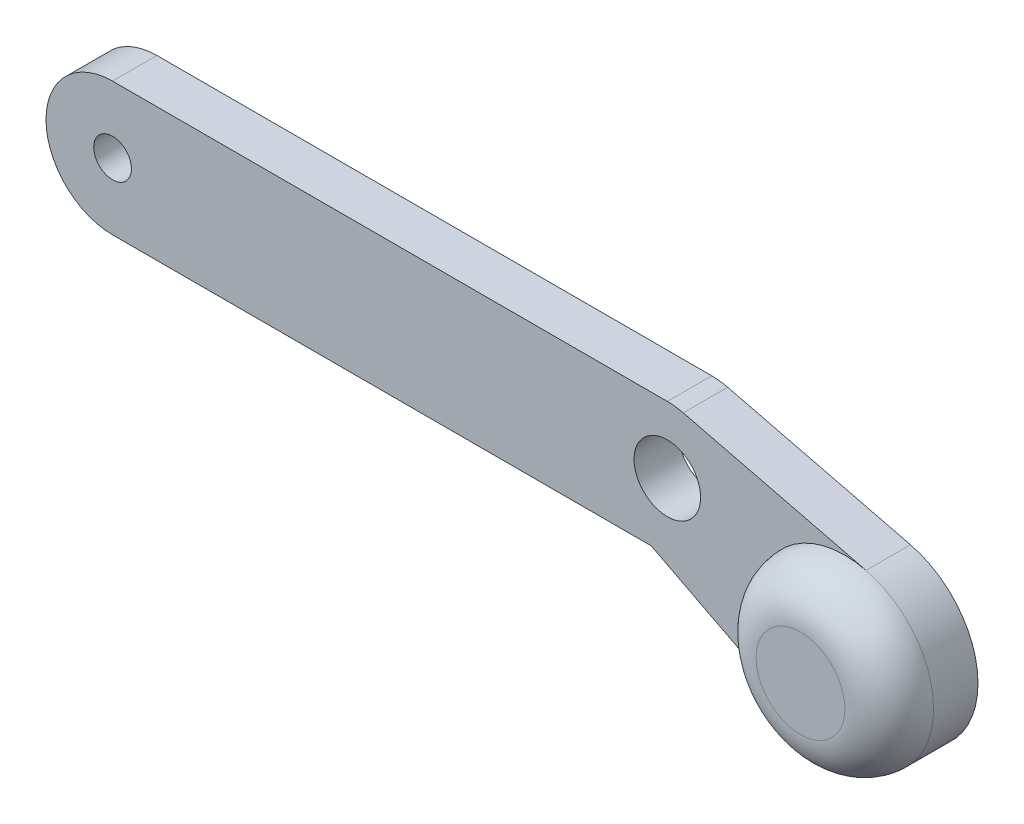
ISO-10303-21;
HEADER;
FILE_DESCRIPTION(('STEP AP214'),'2;1');
FILE_NAME('part.step','',(''),(''),'','','');
FILE_SCHEMA(('AUTOMOTIVE_DESIGN { 1 0 10303 214 1 1 1 1 }'));
ENDSEC;
DATA;
#1=APPLICATION_CONTEXT('core data for automotive mechanical design processes');
#2=APPLICATION_PROTOCOL_DEFINITION('international standard','automotive_design',2000,#1);
#3=PRODUCT_CONTEXT('',#1,'mechanical');
#4=PRODUCT('Part','Part','',(#3));
#5=PRODUCT_RELATED_PRODUCT_CATEGORY('part','',(#4));
#6=PRODUCT_DEFINITION_FORMATION('','',#4);
#7=PRODUCT_DEFINITION_CONTEXT('part definition',#1,'design');
#8=PRODUCT_DEFINITION('design','',#6,#7);
#9=PRODUCT_DEFINITION_SHAPE('','',#8);
#10=(LENGTH_UNIT() NAMED_UNIT(*) SI_UNIT(.MILLI.,.METRE.));
#11=(NAMED_UNIT(*) PLANE_ANGLE_UNIT() SI_UNIT($,.RADIAN.));
#12=(NAMED_UNIT(*) SI_UNIT($,.STERADIAN.) SOLID_ANGLE_UNIT());
#13=UNCERTAINTY_MEASURE_WITH_UNIT(LENGTH_MEASURE(1.E-05),#10,'distance_accuracy_value','');
#14=(GEOMETRIC_REPRESENTATION_CONTEXT(3) GLOBAL_UNCERTAINTY_ASSIGNED_CONTEXT((#13)) GLOBAL_UNIT_ASSIGNED_CONTEXT((#10,
#11,#12)) REPRESENTATION_CONTEXT('',''));
#15=CARTESIAN_POINT('',(0.,0.,0.));
#16=DIRECTION('',(0.,0.,1.));
#17=DIRECTION('',(1.,0.,0.));
#18=AXIS2_PLACEMENT_3D('',#15,#16,#17);
#19=CARTESIAN_POINT('',(0.,-3.,-2.));
#20=DIRECTION('',(0.,1.,0.));
#21=DIRECTION('',(0.,0.,-1.));
#22=AXIS2_PLACEMENT_3D('',#19,#20,#21);
#23=PLANE('',#22);
#24=DIRECTION('',(0.,0.,1.));
#25=VECTOR('',#24,1.);
#26=CARTESIAN_POINT('',(24.2720779386421,-3.,-2.));
#27=LINE('',#26,#25);
#28=CARTESIAN_POINT('',(24.2720779386421,-3.,-2.));
#29=VERTEX_POINT('',#28);
#30=CARTESIAN_POINT('',(24.2720779386421,-3.,0.));
#31=VERTEX_POINT('',#30);
#32=EDGE_CURVE('E139',#29,#31,#27,.T.);
#33=ORIENTED_EDGE('',*,*,#32,.T.);
#34=DIRECTION('',(1.,0.,0.));
#35=VECTOR('',#34,1.);
#36=CARTESIAN_POINT('',(0.,-3.,0.));
#37=LINE('',#36,#35);
#38=CARTESIAN_POINT('',(0.,-3.,0.));
#39=VERTEX_POINT('',#38);
#40=EDGE_CURVE('E168',#39,#31,#37,.T.);
#41=ORIENTED_EDGE('',*,*,#40,.F.);
#42=DIRECTION('',(0.,0.,1.));
#43=VECTOR('',#42,1.);
#44=CARTESIAN_POINT('',(0.,-3.,-2.));
#45=LINE('',#44,#43);
#46=CARTESIAN_POINT('',(0.,-3.,-2.));
#47=VERTEX_POINT('',#46);
#48=EDGE_CURVE('E125',#47,#39,#45,.T.);
#49=ORIENTED_EDGE('',*,*,#48,.F.);
#50=DIRECTION('',(1.,0.,0.));
#51=VECTOR('',#50,1.);
#52=CARTESIAN_POINT('',(0.,-3.,-2.));
#53=LINE('',#52,#51);
#54=EDGE_CURVE('E157',#47,#29,#53,.T.);
#55=ORIENTED_EDGE('',*,*,#54,.T.);
#56=EDGE_LOOP('',(#33,#41,#49,#55));
#57=FACE_BOUND('',#56,.T.);
#58=ADVANCED_FACE('F39',(#57),#23,.F.);
#59=CARTESIAN_POINT('',(0.,0.,-2.));
#60=DIRECTION('',(0.,0.,-1.));
#61=DIRECTION('',(1.,0.,0.));
#62=AXIS2_PLACEMENT_3D('',#59,#60,#61);
#63=PLANE('',#62);
#64=ORIENTED_EDGE('',*,*,#54,.F.);
#65=CARTESIAN_POINT('',(0.,0.,-2.));
#66=DIRECTION('',(0.,0.,1.));
#67=DIRECTION('',(1.,0.,0.));
#68=AXIS2_PLACEMENT_3D('',#65,#66,#67);
#69=CIRCLE('',#68,3.);
#70=CARTESIAN_POINT('',(0.,3.,-2.));
#71=VERTEX_POINT('',#70);
#72=EDGE_CURVE('E155',#71,#47,#69,.T.);
#73=ORIENTED_EDGE('',*,*,#72,.F.);
#74=DIRECTION('',(-1.,0.,0.));
#75=VECTOR('',#74,1.);
#76=CARTESIAN_POINT('',(0.,3.,-2.));
#77=LINE('',#76,#75);
#78=CARTESIAN_POINT('',(25.,3.,-2.));
#79=VERTEX_POINT('',#78);
#80=EDGE_CURVE('E163',#79,#71,#77,.T.);
#81=ORIENTED_EDGE('',*,*,#80,.F.);
#82=CARTESIAN_POINT('',(25.,0.,-2.));
#83=DIRECTION('',(0.,0.,1.));
#84=DIRECTION('',(1.,0.,0.));
#85=AXIS2_PLACEMENT_3D('',#82,#83,#84);
#86=CIRCLE('',#85,3.);
#87=CARTESIAN_POINT('',(25.7173634570979,2.91296921892775,-2.));
#88=VERTEX_POINT('',#87);
#89=EDGE_CURVE('E160',#88,#79,#86,.T.);
#90=ORIENTED_EDGE('',*,*,#89,.F.);
#91=DIRECTION('',(0.970989739642583,-0.239121152365969,0.));
#92=VECTOR('',#91,1.);
#93=CARTESIAN_POINT('',(2.14683659481863,8.71757385589941,-2.));
#94=LINE('',#93,#92);
#95=CARTESIAN_POINT('',(33.9564846094639,0.883958958570331,-2.));
#96=VERTEX_POINT('',#95);
#97=EDGE_CURVE('E132',#88,#96,#94,.T.);
#98=ORIENTED_EDGE('',*,*,#97,.T.);
#99=CARTESIAN_POINT('',(33.,-3.,-2.));
#100=DIRECTION('',(0.,0.,-1.));
#101=DIRECTION('',(-1.,0.,0.));
#102=AXIS2_PLACEMENT_3D('',#99,#100,#101);
#103=CIRCLE('',#102,4.);
#104=CARTESIAN_POINT('',(31.166803061769,-6.55519183528266,-2.));
#105=VERTEX_POINT('',#104);
#106=EDGE_CURVE('E109',#96,#105,#103,.T.);
#107=ORIENTED_EDGE('',*,*,#106,.T.);
#108=DIRECTION('',(0.888797958820665,-0.458299234557749,0.));
#109=VECTOR('',#108,1.);
#110=CARTESIAN_POINT('',(3.87605700623222,7.51699172863803,-2.));
#111=LINE('',#110,#109);
#112=EDGE_CURVE('E54',#29,#105,#111,.T.);
#113=ORIENTED_EDGE('',*,*,#112,.F.);
#114=EDGE_LOOP('',(#64,#73,#81,#90,#98,#107,#113));
#115=FACE_BOUND('',#114,.T.);
#116=CARTESIAN_POINT('',(25.,0.,-2.));
#117=DIRECTION('',(0.,0.,1.));
#118=DIRECTION('',(1.,0.,0.));
#119=AXIS2_PLACEMENT_3D('',#116,#117,#118);
#120=CIRCLE('',#119,1.5);
#121=CARTESIAN_POINT('',(26.5,0.,-2.));
#122=VERTEX_POINT('',#121);
#123=EDGE_CURVE('E149',#122,#122,#120,.T.);
#124=ORIENTED_EDGE('',*,*,#123,.T.);
#125=EDGE_LOOP('',(#124));
#126=FACE_BOUND('',#125,.T.);
#127=CARTESIAN_POINT('',(0.,0.,-2.));
#128=DIRECTION('',(0.,0.,-1.));
#129=DIRECTION('',(-1.,0.,0.));
#130=AXIS2_PLACEMENT_3D('',#127,#128,#129);
#131=CIRCLE('',#130,0.85);
#132=CARTESIAN_POINT('',(-0.85,0.,-2.));
#133=VERTEX_POINT('',#132);
#134=EDGE_CURVE('E143',#133,#133,#131,.T.);
#135=ORIENTED_EDGE('',*,*,#134,.F.);
#136=EDGE_LOOP('',(#135));
#137=FACE_BOUND('',#136,.T.);
#138=ADVANCED_FACE('F190',(#115,#126,#137),#63,.T.);
#139=CARTESIAN_POINT('',(0.,0.,0.));
#140=DIRECTION('',(0.,0.,-1.));
#141=DIRECTION('',(1.,0.,0.));
#142=AXIS2_PLACEMENT_3D('',#139,#140,#141);
#143=PLANE('',#142);
#144=CARTESIAN_POINT('',(33.,-3.,0.));
#145=DIRECTION('',(0.,0.,-1.));
#146=DIRECTION('',(-1.,0.,0.));
#147=AXIS2_PLACEMENT_3D('',#144,#145,#146);
#148=CIRCLE('',#147,4.);
#149=CARTESIAN_POINT('',(31.166803061769,-6.55519183528266,0.));
#150=VERTEX_POINT('',#149);
#151=CARTESIAN_POINT('',(33.9564846094639,0.883958958570335,0.));
#152=VERTEX_POINT('',#151);
#153=EDGE_CURVE('E103',#150,#152,#148,.T.);
#154=ORIENTED_EDGE('',*,*,#153,.T.);
#155=DIRECTION('',(0.970989739642583,-0.239121152365969,0.));
#156=VECTOR('',#155,1.);
#157=CARTESIAN_POINT('',(2.14683659481863,8.71757385589941,0.));
#158=LINE('',#157,#156);
#159=CARTESIAN_POINT('',(25.7173634570979,2.91296921892775,0.));
#160=VERTEX_POINT('',#159);
#161=EDGE_CURVE('E116',#160,#152,#158,.T.);
#162=ORIENTED_EDGE('',*,*,#161,.F.);
#163=CARTESIAN_POINT('',(25.,0.,0.));
#164=DIRECTION('',(0.,0.,1.));
#165=DIRECTION('',(1.,0.,0.));
#166=AXIS2_PLACEMENT_3D('',#163,#164,#165);
#167=CIRCLE('',#166,3.);
#168=CARTESIAN_POINT('',(25.,3.,0.));
#169=VERTEX_POINT('',#168);
#170=EDGE_CURVE('E170',#160,#169,#167,.T.);
#171=ORIENTED_EDGE('',*,*,#170,.T.);
#172=DIRECTION('',(-1.,0.,0.));
#173=VECTOR('',#172,1.);
#174=CARTESIAN_POINT('',(0.,3.,0.));
#175=LINE('',#174,#173);
#176=CARTESIAN_POINT('',(0.,3.,0.));
#177=VERTEX_POINT('',#176);
#178=EDGE_CURVE('E158',#169,#177,#175,.T.);
#179=ORIENTED_EDGE('',*,*,#178,.T.);
#180=CARTESIAN_POINT('',(0.,0.,0.));
#181=DIRECTION('',(0.,0.,1.));
#182=DIRECTION('',(1.,0.,0.));
#183=AXIS2_PLACEMENT_3D('',#180,#181,#182);
#184=CIRCLE('',#183,3.);
#185=EDGE_CURVE('E152',#177,#39,#184,.T.);
#186=ORIENTED_EDGE('',*,*,#185,.T.);
#187=ORIENTED_EDGE('',*,*,#40,.T.);
#188=DIRECTION('',(0.888797958820665,-0.458299234557749,0.));
#189=VECTOR('',#188,1.);
#190=CARTESIAN_POINT('',(3.87605700623222,7.51699172863803,0.));
#191=LINE('',#190,#189);
#192=EDGE_CURVE('E62',#31,#150,#191,.T.);
#193=ORIENTED_EDGE('',*,*,#192,.T.);
#194=EDGE_LOOP('',(#154,#162,#171,#179,#186,#187,#193));
#195=FACE_BOUND('',#194,.T.);
#196=CARTESIAN_POINT('',(25.,0.,0.));
#197=DIRECTION('',(0.,0.,1.));
#198=DIRECTION('',(1.,0.,0.));
#199=AXIS2_PLACEMENT_3D('',#196,#197,#198);
#200=CIRCLE('',#199,1.5);
#201=CARTESIAN_POINT('',(26.5,0.,0.));
#202=VERTEX_POINT('',#201);
#203=EDGE_CURVE('E146',#202,#202,#200,.T.);
#204=ORIENTED_EDGE('',*,*,#203,.F.);
#205=EDGE_LOOP('',(#204));
#206=FACE_BOUND('',#205,.T.);
#207=CARTESIAN_POINT('',(0.,0.,0.));
#208=DIRECTION('',(0.,0.,-1.));
#209=DIRECTION('',(-1.,0.,0.));
#210=AXIS2_PLACEMENT_3D('',#207,#208,#209);
#211=CIRCLE('',#210,0.85);
#212=CARTESIAN_POINT('',(-0.85,0.,0.));
#213=VERTEX_POINT('',#212);
#214=EDGE_CURVE('E138',#213,#213,#211,.T.);
#215=ORIENTED_EDGE('',*,*,#214,.T.);
#216=EDGE_LOOP('',(#215));
#217=FACE_BOUND('',#216,.T.);
#218=ADVANCED_FACE('F123',(#195,#206,#217),#143,.F.);
#219=CARTESIAN_POINT('',(0.,0.,-2.));
#220=DIRECTION('',(0.,0.,1.));
#221=DIRECTION('',(-1.,0.,0.));
#222=AXIS2_PLACEMENT_3D('',#219,#220,#221);
#223=CYLINDRICAL_SURFACE('',#222,3.);
#224=ORIENTED_EDGE('',*,*,#185,.F.);
#225=DIRECTION('',(0.,0.,1.));
#226=VECTOR('',#225,1.);
#227=CARTESIAN_POINT('',(0.,3.,-2.));
#228=LINE('',#227,#226);
#229=EDGE_CURVE('E166',#71,#177,#228,.T.);
#230=ORIENTED_EDGE('',*,*,#229,.F.);
#231=ORIENTED_EDGE('',*,*,#72,.T.);
#232=ORIENTED_EDGE('',*,*,#48,.T.);
#233=EDGE_LOOP('',(#224,#230,#231,#232));
#234=FACE_BOUND('',#233,.T.);
#235=ADVANCED_FACE('F186',(#234),#223,.T.);
#236=CARTESIAN_POINT('',(25.,0.,-2.));
#237=DIRECTION('',(0.,0.,1.));
#238=DIRECTION('',(-1.,0.,0.));
#239=AXIS2_PLACEMENT_3D('',#236,#237,#238);
#240=CYLINDRICAL_SURFACE('',#239,3.);
#241=ORIENTED_EDGE('',*,*,#89,.T.);
#242=DIRECTION('',(0.,0.,1.));
#243=VECTOR('',#242,1.);
#244=CARTESIAN_POINT('',(25.,3.,-2.));
#245=LINE('',#244,#243);
#246=EDGE_CURVE('E129',#79,#169,#245,.T.);
#247=ORIENTED_EDGE('',*,*,#246,.T.);
#248=ORIENTED_EDGE('',*,*,#170,.F.);
#249=DIRECTION('',(0.,0.,1.));
#250=VECTOR('',#249,1.);
#251=CARTESIAN_POINT('',(25.7173634570979,2.91296921892775,-2.));
#252=LINE('',#251,#250);
#253=EDGE_CURVE('E118',#88,#160,#252,.T.);
#254=ORIENTED_EDGE('',*,*,#253,.F.);
#255=EDGE_LOOP('',(#241,#247,#248,#254));
#256=FACE_BOUND('',#255,.T.);
#257=ADVANCED_FACE('F177',(#256),#240,.T.);
#258=CARTESIAN_POINT('',(0.,3.,-2.));
#259=DIRECTION('',(0.,-1.,0.));
#260=DIRECTION('',(0.,0.,1.));
#261=AXIS2_PLACEMENT_3D('',#258,#259,#260);
#262=PLANE('',#261);
#263=ORIENTED_EDGE('',*,*,#178,.F.);
#264=ORIENTED_EDGE('',*,*,#246,.F.);
#265=ORIENTED_EDGE('',*,*,#80,.T.);
#266=ORIENTED_EDGE('',*,*,#229,.T.);
#267=EDGE_LOOP('',(#263,#264,#265,#266));
#268=FACE_BOUND('',#267,.T.);
#269=ADVANCED_FACE('F181',(#268),#262,.F.);
#270=CARTESIAN_POINT('',(25.,0.,-2.));
#271=DIRECTION('',(0.,0.,1.));
#272=DIRECTION('',(-1.,0.,0.));
#273=AXIS2_PLACEMENT_3D('',#270,#271,#272);
#274=CYLINDRICAL_SURFACE('',#273,1.5);
#275=ORIENTED_EDGE('',*,*,#123,.F.);
#276=EDGE_LOOP('',(#275));
#277=FACE_BOUND('',#276,.T.);
#278=ORIENTED_EDGE('',*,*,#203,.T.);
#279=EDGE_LOOP('',(#278));
#280=FACE_BOUND('',#279,.T.);
#281=ADVANCED_FACE('F201',(#277,#280),#274,.F.);
#282=CARTESIAN_POINT('',(0.,0.,-2.));
#283=DIRECTION('',(0.,0.,1.));
#284=DIRECTION('',(-1.,0.,0.));
#285=AXIS2_PLACEMENT_3D('',#282,#283,#284);
#286=CYLINDRICAL_SURFACE('',#285,0.85);
#287=ORIENTED_EDGE('',*,*,#134,.T.);
#288=EDGE_LOOP('',(#287));
#289=FACE_BOUND('',#288,.T.);
#290=ORIENTED_EDGE('',*,*,#214,.F.);
#291=EDGE_LOOP('',(#290));
#292=FACE_BOUND('',#291,.T.);
#293=ADVANCED_FACE('F198',(#289,#292),#286,.F.);
#294=CARTESIAN_POINT('',(2.14683659481863,8.71757385589941,-2.));
#295=DIRECTION('',(0.239121152365969,0.970989739642583,0.));
#296=DIRECTION('',(-0.970989739642583,0.239121152365969,0.));
#297=AXIS2_PLACEMENT_3D('',#294,#295,#296);
#298=PLANE('',#297);
#299=ORIENTED_EDGE('',*,*,#161,.T.);
#300=DIRECTION('',(0.,0.,1.));
#301=VECTOR('',#300,1.);
#302=CARTESIAN_POINT('',(33.9564846094639,0.883958958570331,-2.));
#303=LINE('',#302,#301);
#304=EDGE_CURVE('E106',#96,#152,#303,.T.);
#305=ORIENTED_EDGE('',*,*,#304,.F.);
#306=ORIENTED_EDGE('',*,*,#97,.F.);
#307=ORIENTED_EDGE('',*,*,#253,.T.);
#308=EDGE_LOOP('',(#299,#305,#306,#307));
#309=FACE_BOUND('',#308,.T.);
#310=ADVANCED_FACE('F117',(#309),#298,.T.);
#311=CARTESIAN_POINT('',(3.87605700623222,7.51699172863803,-2.));
#312=DIRECTION('',(0.458299234557749,0.888797958820665,0.));
#313=DIRECTION('',(-0.888797958820665,0.458299234557749,0.));
#314=AXIS2_PLACEMENT_3D('',#311,#312,#313);
#315=PLANE('',#314);
#316=ORIENTED_EDGE('',*,*,#192,.F.);
#317=ORIENTED_EDGE('',*,*,#32,.F.);
#318=ORIENTED_EDGE('',*,*,#112,.T.);
#319=DIRECTION('',(0.,0.,1.));
#320=VECTOR('',#319,1.);
#321=CARTESIAN_POINT('',(31.166803061769,-6.55519183528266,-2.));
#322=LINE('',#321,#320);
#323=EDGE_CURVE('E113',#105,#150,#322,.T.);
#324=ORIENTED_EDGE('',*,*,#323,.T.);
#325=EDGE_LOOP('',(#316,#317,#318,#324));
#326=FACE_BOUND('',#325,.T.);
#327=ADVANCED_FACE('F189',(#326),#315,.F.);
#328=CARTESIAN_POINT('',(33.,-3.,-2.));
#329=DIRECTION('',(0.,0.,1.));
#330=DIRECTION('',(-1.,0.,0.));
#331=AXIS2_PLACEMENT_3D('',#328,#329,#330);
#332=CYLINDRICAL_SURFACE('',#331,4.);
#333=ORIENTED_EDGE('',*,*,#323,.F.);
#334=ORIENTED_EDGE('',*,*,#106,.F.);
#335=ORIENTED_EDGE('',*,*,#304,.T.);
#336=CARTESIAN_POINT('',(33.,-3.,0.));
#337=DIRECTION('',(0.,0.,-1.));
#338=DIRECTION('',(-1.,0.,0.));
#339=AXIS2_PLACEMENT_3D('',#336,#337,#338);
#340=CIRCLE('',#339,4.);
#341=EDGE_CURVE('E11',#150,#152,#340,.F.);
#342=ORIENTED_EDGE('',*,*,#341,.F.);
#343=EDGE_LOOP('',(#333,#334,#335,#342));
#344=FACE_BOUND('',#343,.T.);
#345=ADVANCED_FACE('F108',(#344),#332,.T.);
#346=CARTESIAN_POINT('',(33.,-3.,2.));
#347=DIRECTION('',(0.,0.,1.));
#348=DIRECTION('',(-1.,0.,0.));
#349=AXIS2_PLACEMENT_3D('',#346,#347,#348);
#350=PLANE('',#349);
#351=CARTESIAN_POINT('',(33.,-3.,2.));
#352=DIRECTION('',(0.,0.,-1.));
#353=DIRECTION('',(-1.,0.,0.));
#354=AXIS2_PLACEMENT_3D('',#351,#352,#353);
#355=CIRCLE('',#354,2.);
#356=CARTESIAN_POINT('',(31.,-3.,2.));
#357=VERTEX_POINT('',#356);
#358=EDGE_CURVE('E47',#357,#357,#355,.T.);
#359=ORIENTED_EDGE('',*,*,#358,.F.);
#360=EDGE_LOOP('',(#359));
#361=FACE_BOUND('',#360,.T.);
#362=ADVANCED_FACE('F231',(#361),#350,.T.);
#363=CARTESIAN_POINT('',(33.,-3.,0.));
#364=DIRECTION('',(0.,0.,1.));
#365=DIRECTION('',(-1.,0.,0.));
#366=AXIS2_PLACEMENT_3D('',#363,#364,#365);
#367=DEGENERATE_TOROIDAL_SURFACE('',#366,2.,2.,.T.);
#368=ORIENTED_EDGE('',*,*,#153,.F.);
#369=ORIENTED_EDGE('',*,*,#341,.T.);
#370=EDGE_LOOP('',(#368,#369));
#371=FACE_BOUND('',#370,.T.);
#372=ORIENTED_EDGE('',*,*,#358,.T.);
#373=EDGE_LOOP('',(#372));
#374=FACE_BOUND('',#373,.T.);
#375=ADVANCED_FACE('F41',(#371,#374),#367,.T.);
#376=CLOSED_SHELL('',(#58,#138,#218,#235,#257,#269,#281,#293,#310,#327,#345,#362,#375));
#377=MANIFOLD_SOLID_BREP('B2',#376);
#378=ADVANCED_BREP_SHAPE_REPRESENTATION('',(#18,#377),#14);
#379=SHAPE_DEFINITION_REPRESENTATION(#9,#378);
ENDSEC;
END-ISO-10303-21;
